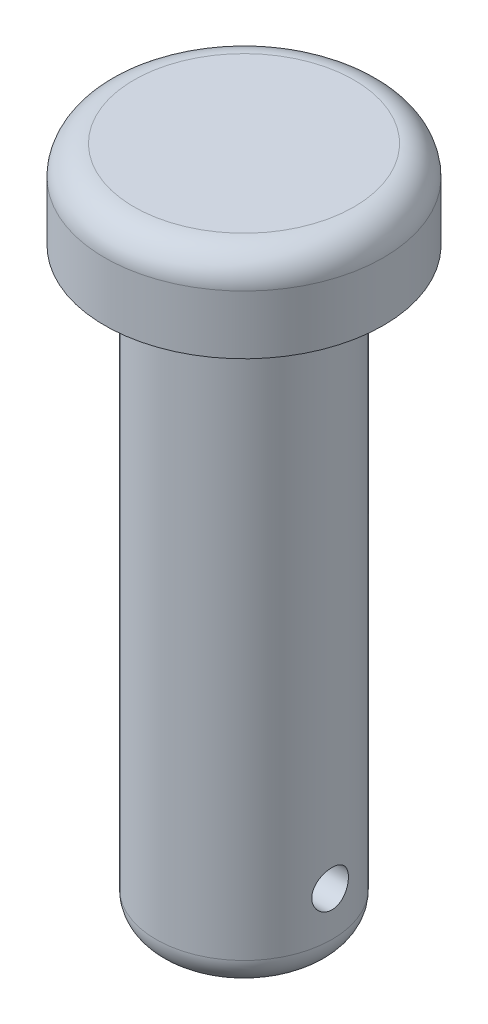
ISO-10303-21;
HEADER;
FILE_DESCRIPTION(('STEP AP214'),'2;1');
FILE_NAME('part.step','',(''),(''),'','','');
FILE_SCHEMA(('AUTOMOTIVE_DESIGN { 1 0 10303 214 1 1 1 1 }'));
ENDSEC;
DATA;
#1=APPLICATION_CONTEXT('core data for automotive mechanical design processes');
#2=APPLICATION_PROTOCOL_DEFINITION('international standard','automotive_design',2000,#1);
#3=PRODUCT_CONTEXT('',#1,'mechanical');
#4=PRODUCT('Part','Part','',(#3));
#5=PRODUCT_RELATED_PRODUCT_CATEGORY('part','',(#4));
#6=PRODUCT_DEFINITION_FORMATION('','',#4);
#7=PRODUCT_DEFINITION_CONTEXT('part definition',#1,'design');
#8=PRODUCT_DEFINITION('design','',#6,#7);
#9=PRODUCT_DEFINITION_SHAPE('','',#8);
#10=(LENGTH_UNIT() NAMED_UNIT(*) SI_UNIT(.MILLI.,.METRE.));
#11=(NAMED_UNIT(*) PLANE_ANGLE_UNIT() SI_UNIT($,.RADIAN.));
#12=(NAMED_UNIT(*) SI_UNIT($,.STERADIAN.) SOLID_ANGLE_UNIT());
#13=UNCERTAINTY_MEASURE_WITH_UNIT(LENGTH_MEASURE(1.E-05),#10,'distance_accuracy_value','');
#14=(GEOMETRIC_REPRESENTATION_CONTEXT(3) GLOBAL_UNCERTAINTY_ASSIGNED_CONTEXT((#13)) GLOBAL_UNIT_ASSIGNED_CONTEXT((#10,
#11,#12)) REPRESENTATION_CONTEXT('',''));
#15=CARTESIAN_POINT('',(0.,0.,0.));
#16=DIRECTION('',(0.,0.,1.));
#17=DIRECTION('',(1.,0.,0.));
#18=AXIS2_PLACEMENT_3D('',#15,#16,#17);
#19=CARTESIAN_POINT('',(0.,0.,0.));
#20=DIRECTION('',(0.,-1.,0.));
#21=DIRECTION('',(1.,0.,0.));
#22=AXIS2_PLACEMENT_3D('',#19,#20,#21);
#23=PLANE('',#22);
#24=CARTESIAN_POINT('',(0.,0.,0.));
#25=DIRECTION('',(0.,-1.,0.));
#26=DIRECTION('',(1.,0.,0.));
#27=AXIS2_PLACEMENT_3D('',#24,#25,#26);
#28=CIRCLE('',#27,7.99999999999997);
#29=CARTESIAN_POINT('',(7.99999999999997,0.,0.));
#30=VERTEX_POINT('',#29);
#31=EDGE_CURVE('E12',#30,#30,#28,.T.);
#32=ORIENTED_EDGE('',*,*,#31,.T.);
#33=EDGE_LOOP('',(#32));
#34=FACE_BOUND('',#33,.T.);
#35=ADVANCED_FACE('F50',(#34),#23,.T.);
#36=CARTESIAN_POINT('',(0.,4.,0.));
#37=DIRECTION('',(0.,-1.,0.));
#38=DIRECTION('',(1.,0.,0.));
#39=AXIS2_PLACEMENT_3D('',#36,#37,#38);
#40=TOROIDAL_SURFACE('',#39,8.00000000000001,4.);
#41=CARTESIAN_POINT('',(0.,4.00000000000001,0.));
#42=DIRECTION('',(0.,-1.,0.));
#43=DIRECTION('',(1.,0.,0.));
#44=AXIS2_PLACEMENT_3D('',#41,#42,#43);
#45=CIRCLE('',#44,12.);
#46=CARTESIAN_POINT('',(12.,4.00000000000006,0.));
#47=VERTEX_POINT('',#46);
#48=EDGE_CURVE('E63',#47,#47,#45,.T.);
#49=ORIENTED_EDGE('',*,*,#48,.T.);
#50=EDGE_LOOP('',(#49));
#51=FACE_BOUND('',#50,.T.);
#52=ORIENTED_EDGE('',*,*,#31,.F.);
#53=EDGE_LOOP('',(#52));
#54=FACE_BOUND('',#53,.T.);
#55=ADVANCED_FACE('F105',(#51,#54),#40,.T.);
#56=CARTESIAN_POINT('',(2.85188539450587E-12,-790.652262501241,-1.17961196366423E-13));
#57=DIRECTION('',(0.,-1.,0.));
#58=DIRECTION('',(1.,0.,0.));
#59=AXIS2_PLACEMENT_3D('',#56,#57,#58);
#60=CYLINDRICAL_SURFACE('',#59,12.0000000000001);
#61=CARTESIAN_POINT('',(12.0000000000001,12.5,0.));
#62=CARTESIAN_POINT('',(11.9999974305331,12.4999950450616,0.138818083403371));
#63=CARTESIAN_POINT('',(11.9975665755012,12.4883986685625,0.277697579041803));
#64=CARTESIAN_POINT('',(11.9881040198139,12.4423613009343,0.551522632534029));
#65=CARTESIAN_POINT('',(11.981068823785,12.4079029539262,0.686465120256656));
#66=CARTESIAN_POINT('',(11.9631821839241,12.3172590901564,0.948418264582725));
#67=CARTESIAN_POINT('',(11.9523345410532,12.2610952080022,1.07543667341843));
#68=CARTESIAN_POINT('',(11.9279985561975,12.1287007822877,1.31824065721199));
#69=CARTESIAN_POINT('',(11.9145103325195,12.0524711376884,1.43402673506871));
#70=CARTESIAN_POINT('',(11.8861540004931,11.8809273196187,1.65278064861773));
#71=CARTESIAN_POINT('',(11.8712701169709,11.7853759975298,1.75556048832544));
#72=CARTESIAN_POINT('',(11.8419131538493,11.5784106816098,1.94375555353883));
#73=CARTESIAN_POINT('',(11.8274401083337,11.4669953762555,2.02916934192198));
#74=CARTESIAN_POINT('',(11.8003888519062,11.2300960624677,2.18102063354434));
#75=CARTESIAN_POINT('',(11.7878309034969,11.1044832309945,2.24726109361307));
#76=CARTESIAN_POINT('',(11.7662568130007,10.8436050964545,2.35762238696133));
#77=CARTESIAN_POINT('',(11.7572402893515,10.7083408351149,2.40174560335284));
#78=CARTESIAN_POINT('',(11.7439300197225,10.4340295251687,2.46600480267475));
#79=CARTESIAN_POINT('',(11.7395711371177,10.2950632813305,2.48647195393602));
#80=CARTESIAN_POINT('',(11.7358738143302,10.0156063142747,2.50386715311234));
#81=CARTESIAN_POINT('',(11.7365348160197,9.87511576226941,2.50079781789376));
#82=CARTESIAN_POINT('',(11.7427434863836,9.59903794404967,2.47147438074397));
#83=CARTESIAN_POINT('',(11.7482106735984,9.46340804067761,2.44560210465445));
#84=CARTESIAN_POINT('',(11.7632887523192,9.19845698071018,2.37201087059896));
#85=CARTESIAN_POINT('',(11.7728998568264,9.06913614878736,2.32429078962768));
#86=CARTESIAN_POINT('',(11.7952638292821,8.81938554316806,2.20800006427861));
#87=CARTESIAN_POINT('',(11.8080390757121,8.6990274069459,2.13928005068479));
#88=CARTESIAN_POINT('',(11.8352778002148,8.47140851146371,1.9830453985497));
#89=CARTESIAN_POINT('',(11.8497414879708,8.36414938232805,1.89552842452524));
#90=CARTESIAN_POINT('',(11.8790746185983,8.16357207783926,1.70214984309364));
#91=CARTESIAN_POINT('',(11.8939464639898,8.07056766220601,1.59596286682424));
#92=CARTESIAN_POINT('',(11.9221617628604,7.90363911554209,1.36933457722367));
#93=CARTESIAN_POINT('',(11.9355051934048,7.82971527080322,1.24889305005159));
#94=CARTESIAN_POINT('',(11.9591974188564,7.7029798369281,0.996811082471019));
#95=CARTESIAN_POINT('',(11.9695407942055,7.65020639086579,0.86515092385307));
#96=CARTESIAN_POINT('',(11.9860267642259,7.56761659032904,0.59456924194438));
#97=CARTESIAN_POINT('',(11.9921699119212,7.53779721353721,0.455648677190239));
#98=CARTESIAN_POINT('',(11.9994855043092,7.50241149586424,0.177183731401719));
#99=CARTESIAN_POINT('',(12.0007458707519,7.49641611701152,0.0376961110524026));
#100=CARTESIAN_POINT('',(11.9983990450558,7.50768989993822,-0.240287597515389));
#101=CARTESIAN_POINT('',(11.9947921509632,7.52495763720319,-0.378783745924479));
#102=CARTESIAN_POINT('',(11.9831712995838,7.58191130693907,-0.649452734239598));
#103=CARTESIAN_POINT('',(11.9752010573619,7.62137497076696,-0.781674385788389));
#104=CARTESIAN_POINT('',(11.9557445448482,7.72135572084284,-1.03762289332264));
#105=CARTESIAN_POINT('',(11.9442579948917,7.78187448173197,-1.16134907267352));
#106=CARTESIAN_POINT('',(11.9188248298144,7.92316075647513,-1.39858861388696));
#107=CARTESIAN_POINT('',(11.9048478762469,8.00418385913816,-1.51194643893964));
#108=CARTESIAN_POINT('',(11.8760513659945,8.18383912615258,-1.72361089177302));
#109=CARTESIAN_POINT('',(11.8612317108503,8.28247335103789,-1.82191575582654));
#110=CARTESIAN_POINT('',(11.8321204906276,8.49651115399941,-2.00235729730357));
#111=CARTESIAN_POINT('',(11.8178417861503,8.61216606391059,-2.08419829200405));
#112=CARTESIAN_POINT('',(11.7917120203164,8.85583256842761,-2.22729438158484));
#113=CARTESIAN_POINT('',(11.7798608578931,8.98384364827822,-2.28855033355726));
#114=CARTESIAN_POINT('',(11.7600340141609,9.24792239259647,-2.38834492887842));
#115=CARTESIAN_POINT('',(11.752037455694,9.38394207433169,-2.42700619656059));
#116=CARTESIAN_POINT('',(11.7407836941942,9.66073310098455,-2.4808807704681));
#117=CARTESIAN_POINT('',(11.7375258132075,9.8015037632389,-2.49609743088879));
#118=CARTESIAN_POINT('',(11.7361581461703,10.0808268019993,-2.5025185297522));
#119=CARTESIAN_POINT('',(11.7379480464303,10.2193681404441,-2.49419085245447));
#120=CARTESIAN_POINT('',(11.7462489450988,10.4930280178404,-2.45479810628059));
#121=CARTESIAN_POINT('',(11.7527598981926,10.6281465896322,-2.42373325564528));
#122=CARTESIAN_POINT('',(11.7697226489544,10.8907955437813,-2.33996435537166));
#123=CARTESIAN_POINT('',(11.7801631401589,11.0183464929739,-2.28732235136839));
#124=CARTESIAN_POINT('',(11.803814114775,11.2628775520533,-2.16194914599511));
#125=CARTESIAN_POINT('',(11.8170248553093,11.3798566792663,-2.08921607966055));
#126=CARTESIAN_POINT('',(11.845031591023,11.6022432541589,-1.92414739068478));
#127=CARTESIAN_POINT('',(11.8598522773684,11.70739824913,-1.83147578083642));
#128=CARTESIAN_POINT('',(11.8892367916645,11.9008189864527,-1.62984887623065));
#129=CARTESIAN_POINT('',(11.9038005596977,11.989080835103,-1.52088983766591));
#130=CARTESIAN_POINT('',(11.9312288909528,12.1471771463681,-1.28826885501538));
#131=CARTESIAN_POINT('',(11.9440719214652,12.2167873597726,-1.16445184304268));
#132=CARTESIAN_POINT('',(11.9663981698821,12.3341004568601,-0.906639687996895));
#133=CARTESIAN_POINT('',(11.975884323642,12.3818224943638,-0.772653563814463));
#134=CARTESIAN_POINT('',(11.988649995629,12.4450805565769,-0.532030585800179));
#135=CARTESIAN_POINT('',(11.9928807132282,12.4656375264177,-0.426735187455828));
#136=CARTESIAN_POINT('',(11.9985566557955,12.4930989085547,-0.214305348353039));
#137=CARTESIAN_POINT('',(12.0000019836918,12.5000038253344,-0.107170975697702));
#138=CARTESIAN_POINT('',(12.0000000000001,12.5,0.));
#139=B_SPLINE_CURVE_WITH_KNOTS('',3,(#61,#62,#63,#64,#65,#66,#67,#68,#69,#70,#71,#72,#73,#74,
#75,#76,#77,#78,#79,#80,#81,#82,#83,#84,#85,#86,#87,#88,#89,#90,#91,#92,#93,#94,#95,#96,#97,#98,
#99,#100,#101,#102,#103,#104,#105,#106,#107,#108,#109,#110,#111,#112,#113,#114,#115,#116,#117,
#118,#119,#120,#121,#122,#123,#124,#125,#126,#127,#128,#129,#130,#131,#132,#133,#134,#135,#136,
#137,#138),.UNSPECIFIED.,.T.,.F.,(4,2,2,2,2,2,2,2,2,2,2,2,2,2,2,2,2,2,2,2,2,2,2,2,2,2,2,2,2,2,2,
2,2,2,2,2,2,2,4),(0.,0.416062090206361,0.832440399812444,1.2484047576509,1.664350483146,
2.08575052776245,2.5071854310357,2.93280898357097,3.35838666570982,3.77793150339709,
4.19742969534328,4.61003424258117,5.02266000060556,5.43829184833495,5.85397536736065,
6.27779052710928,6.70161204556432,7.12619448999322,7.5507210209154,7.9675667881535,
8.38438703104556,8.79710573265244,9.20985726781867,9.62803167991475,10.0462550512915,
10.4714252765867,10.8965777970262,11.3194010019005,11.7421637082837,12.1565844658208,
12.5710012456272,12.9842346278651,13.3975063816296,13.8183804966062,14.2393515023474,
14.6651772879651,15.0906297292995,15.4118517695456,15.7330619394678),.UNSPECIFIED.);
#140=CARTESIAN_POINT('',(12.0000000000001,12.5,0.));
#141=VERTEX_POINT('',#140);
#142=EDGE_CURVE('E53',#141,#141,#139,.T.);
#143=ORIENTED_EDGE('',*,*,#142,.F.);
#144=EDGE_LOOP('',(#143));
#145=FACE_BOUND('',#144,.T.);
#146=CARTESIAN_POINT('',(-11.7366945943057,10.,-2.49999999999994));
#147=CARTESIAN_POINT('',(-11.7366973843004,9.86121876969623,-2.49999501755294));
#148=CARTESIAN_POINT('',(-11.7391829184982,9.7223760559691,-2.48840458867917));
#149=CARTESIAN_POINT('',(-11.7488403116286,9.44862736536596,-2.44239298467526));
#150=CARTESIAN_POINT('',(-11.756015762766,9.31372448898728,-2.40795430880672));
#151=CARTESIAN_POINT('',(-11.7742058592408,9.05185525433015,-2.31736795014462));
#152=CARTESIAN_POINT('',(-11.7852165141394,8.92488080801636,-2.2612428249786));
#153=CARTESIAN_POINT('',(-11.8098316267142,8.68215100070883,-2.12893977203458));
#154=CARTESIAN_POINT('',(-11.8234359795525,8.56639518653999,-2.05276265471636));
#155=CARTESIAN_POINT('',(-11.8519386932297,8.34760924969307,-1.88127279893214));
#156=CARTESIAN_POINT('',(-11.8668522874608,8.24477621274706,-1.78571110973928));
#157=CARTESIAN_POINT('',(-11.8961593360514,8.05647786270379,-1.57870244776119));
#158=CARTESIAN_POINT('',(-11.9105527521985,7.97101382341712,-1.46725431091193));
#159=CARTESIAN_POINT('',(-11.9373627023772,7.81910822383429,-1.23032410599911));
#160=CARTESIAN_POINT('',(-11.9497591726248,7.75285494707348,-1.10471885640981));
#161=CARTESIAN_POINT('',(-11.971006946866,7.64246789428046,-0.843857102013392));
#162=CARTESIAN_POINT('',(-11.9798586112246,7.59833186969298,-0.708601579901158));
#163=CARTESIAN_POINT('',(-11.9929117978437,7.53404847776509,-0.434325808400997));
#164=CARTESIAN_POINT('',(-11.9971778391985,7.51356796560969,-0.2953867618327));
#165=CARTESIAN_POINT('',(-12.0008022516122,7.49613660848598,-0.0159836976790241));
#166=CARTESIAN_POINT('',(-12.000161134074,7.49918331161383,0.124480159473705));
#167=CARTESIAN_POINT('',(-11.9940931618104,7.52846920191351,0.400653172399168));
#168=CARTESIAN_POINT('',(-11.9887403791317,7.55434943791624,0.536402257452969));
#169=CARTESIAN_POINT('',(-11.9739344179777,7.62799725066262,0.801587492579518));
#170=CARTESIAN_POINT('',(-11.9644810658382,7.67576575440619,0.931023375022058));
#171=CARTESIAN_POINT('',(-11.9424153464786,7.79216010425102,1.18092001076938));
#172=CARTESIAN_POINT('',(-11.9297820825069,7.86092458841931,1.30131426996331));
#173=CARTESIAN_POINT('',(-11.9027460088038,8.01725600568082,1.52898691302131));
#174=CARTESIAN_POINT('',(-11.8883429791667,8.10482527641228,1.63626366363284));
#175=CARTESIAN_POINT('',(-11.8590340046657,8.29824324978213,1.83678840655383));
#176=CARTESIAN_POINT('',(-11.8441236995185,8.40440611996388,1.92973297498961));
#177=CARTESIAN_POINT('',(-11.8157374529799,8.63096409798958,2.09655194480978));
#178=CARTESIAN_POINT('',(-11.8022615435434,8.75135952277448,2.17042592139961));
#179=CARTESIAN_POINT('',(-11.7782599681833,9.00342450965762,2.2971243427691));
#180=CARTESIAN_POINT('',(-11.7677417046425,9.13512130138687,2.34989610979458));
#181=CARTESIAN_POINT('',(-11.7509521282072,9.40578323873877,2.4324715507735));
#182=CARTESIAN_POINT('',(-11.7446802101438,9.5447473456162,2.46227849764702));
#183=CARTESIAN_POINT('',(-11.7372156647828,9.82323941263783,2.49761727734039));
#184=CARTESIAN_POINT('',(-11.7359310372695,9.96270916907408,2.50358885836001));
#185=CARTESIAN_POINT('',(-11.7383390403741,10.2406516230803,2.49227386878594));
#186=CARTESIAN_POINT('',(-11.7420313630527,10.3791243818047,2.47498873715731));
#187=CARTESIAN_POINT('',(-11.7538907645235,10.6496410321163,2.41803116650973));
#188=CARTESIAN_POINT('',(-11.76201022566,10.7817373343577,2.37859682753748));
#189=CARTESIAN_POINT('',(-11.7817667700624,11.0374479788832,2.27871621721842));
#190=CARTESIAN_POINT('',(-11.7934041638213,11.1610615713008,2.21826809112295));
#191=CARTESIAN_POINT('',(-11.819090038744,11.3982128824325,2.07709196362971));
#192=CARTESIAN_POINT('',(-11.8331701329665,11.5115844089324,1.99609065470795));
#193=CARTESIAN_POINT('',(-11.8620696798781,11.7232864983102,1.81646888113978));
#194=CARTESIAN_POINT('',(-11.8768892153308,11.8216153724785,1.71784644101036));
#195=CARTESIAN_POINT('',(-11.9058984863349,12.0021254261943,1.50380090168668));
#196=CARTESIAN_POINT('',(-11.9200734943982,12.0840081900528,1.38812381522911));
#197=CARTESIAN_POINT('',(-11.9459341754481,12.227177504176,1.14440020443274));
#198=CARTESIAN_POINT('',(-11.9576199584165,12.2884649644749,1.01635422695378));
#199=CARTESIAN_POINT('',(-11.9771229654137,12.3882773586347,0.752284235695867));
#200=CARTESIAN_POINT('',(-11.9849632627299,12.4269383310887,0.616313421940422));
#201=CARTESIAN_POINT('',(-11.9959912282046,12.4808288080162,0.339626801006987));
#202=CARTESIAN_POINT('',(-11.9991795068581,12.4960613870655,0.198911618923439));
#203=CARTESIAN_POINT('',(-12.0005281611389,12.502535244097,-0.0804266869406074));
#204=CARTESIAN_POINT('',(-11.9987822750957,12.4942237999895,-0.219039184355756));
#205=CARTESIAN_POINT('',(-11.99065748189,12.4548387226941,-0.492845740747073));
#206=CARTESIAN_POINT('',(-11.984278643459,12.4237654271863,-0.628039850405446));
#207=CARTESIAN_POINT('',(-11.9676092015491,12.339944410703,-0.890863930983977));
#208=CARTESIAN_POINT('',(-11.9573290681437,12.2872546722944,-1.01851310000868));
#209=CARTESIAN_POINT('',(-11.9339599069615,12.1617552045355,-1.26322113444175));
#210=CARTESIAN_POINT('',(-11.9208706346329,12.0889437233117,-1.38027907656017));
#211=CARTESIAN_POINT('',(-11.8930319356997,11.9237806640155,-1.60268064259531));
#212=CARTESIAN_POINT('',(-11.8782576059507,11.8311114238945,-1.70778526722734));
#213=CARTESIAN_POINT('',(-11.8488557363333,11.6295109979979,-1.9011054839652));
#214=CARTESIAN_POINT('',(-11.8342282323046,11.5205759400736,-1.98931704315915));
#215=CARTESIAN_POINT('',(-11.8065838324645,11.287981795159,-2.14734903704121));
#216=CARTESIAN_POINT('',(-11.7935881325423,11.1641631771794,-2.21693856248131));
#217=CARTESIAN_POINT('',(-11.7709407916825,10.9063496879379,-2.33421255844765));
#218=CARTESIAN_POINT('',(-11.7612862067079,10.7723639031215,-2.381916325835));
#219=CARTESIAN_POINT('',(-11.7482800883642,10.5317874368468,-2.44513108264677));
#220=CARTESIAN_POINT('',(-11.743963271902,10.4265409268095,-2.46566898011596));
#221=CARTESIAN_POINT('',(-11.7381695052652,10.2142084389624,-2.49310508716544));
#222=CARTESIAN_POINT('',(-11.736692440763,10.1071225353813,-2.50000384585398));
#223=CARTESIAN_POINT('',(-11.7366945943057,10.,-2.49999999999994));
#224=B_SPLINE_CURVE_WITH_KNOTS('',3,(#146,#147,#148,#149,#150,#151,#152,#153,#154,#155,#156,
#157,#158,#159,#160,#161,#162,#163,#164,#165,#166,#167,#168,#169,#170,#171,#172,#173,#174,#175,
#176,#177,#178,#179,#180,#181,#182,#183,#184,#185,#186,#187,#188,#189,#190,#191,#192,#193,#194,
#195,#196,#197,#198,#199,#200,#201,#202,#203,#204,#205,#206,#207,#208,#209,#210,#211,#212,#213,
#214,#215,#216,#217,#218,#219,#220,#221,#222,#223),.UNSPECIFIED.,.T.,.F.,(4,2,2,2,2,2,2,2,2,2,2,
2,2,2,2,2,2,2,2,2,2,2,2,2,2,2,2,2,2,2,2,2,2,2,2,2,2,2,4),(0.,0.41595130814255,0.832221584834957,
1.24806002960546,1.66388166963158,2.08542666935772,2.50700257327752,2.93258052533688,
3.35811520213862,3.77758097718525,4.19700303792675,4.60994682832919,5.02290810911737,
5.43865743955894,5.85445848208515,6.27811724489822,6.70178544383251,7.12650474664972,
7.55116350775191,7.96795032019582,8.38471134593045,8.79707572463844,9.20947650928061,
9.62767835869302,10.0459271216437,10.4711891750669,10.8964324351808,11.3190919929707,
11.7416960791916,12.1563258784529,12.5709495266596,12.984468211702,13.3980229105635,
13.8187663795715,14.2396101685507,14.6654530271771,15.0909196914727,15.4119973517483,
15.7330620852561),.UNSPECIFIED.);
#225=CARTESIAN_POINT('',(-11.7366945943057,10.,-2.49999999999994));
#226=VERTEX_POINT('',#225);
#227=EDGE_CURVE('E73',#226,#226,#224,.T.);
#228=ORIENTED_EDGE('',*,*,#227,.F.);
#229=EDGE_LOOP('',(#228));
#230=FACE_BOUND('',#229,.T.);
#231=CARTESIAN_POINT('',(-2.84494650060196E-13,80.0000000000001,0.));
#232=DIRECTION('',(0.,-1.,0.));
#233=DIRECTION('',(1.,0.,0.));
#234=AXIS2_PLACEMENT_3D('',#231,#232,#233);
#235=CIRCLE('',#234,12.0000000000003);
#236=CARTESIAN_POINT('',(12.,80.0000000000001,0.));
#237=VERTEX_POINT('',#236);
#238=EDGE_CURVE('E70',#237,#237,#235,.T.);
#239=ORIENTED_EDGE('',*,*,#238,.T.);
#240=EDGE_LOOP('',(#239));
#241=FACE_BOUND('',#240,.T.);
#242=ORIENTED_EDGE('',*,*,#48,.F.);
#243=EDGE_LOOP('',(#242));
#244=FACE_BOUND('',#243,.T.);
#245=ADVANCED_FACE('F79',(#145,#230,#241,#244),#60,.T.);
#246=CARTESIAN_POINT('',(12.,80.0000000000001,0.));
#247=DIRECTION('',(0.,-1.,0.));
#248=DIRECTION('',(1.,0.,0.));
#249=AXIS2_PLACEMENT_3D('',#246,#247,#248);
#250=PLANE('',#249);
#251=CARTESIAN_POINT('',(-2.70616862252382E-13,80.,0.));
#252=DIRECTION('',(0.,-1.,0.));
#253=DIRECTION('',(1.,0.,0.));
#254=AXIS2_PLACEMENT_3D('',#251,#252,#253);
#255=CIRCLE('',#254,19.0000000000003);
#256=CARTESIAN_POINT('',(19.,80.0000000000001,0.));
#257=VERTEX_POINT('',#256);
#258=EDGE_CURVE('E162',#257,#257,#255,.T.);
#259=ORIENTED_EDGE('',*,*,#258,.T.);
#260=EDGE_LOOP('',(#259));
#261=FACE_BOUND('',#260,.T.);
#262=ORIENTED_EDGE('',*,*,#238,.F.);
#263=EDGE_LOOP('',(#262));
#264=FACE_BOUND('',#263,.T.);
#265=ADVANCED_FACE('F98',(#261,#264),#250,.T.);
#266=CARTESIAN_POINT('',(2.85188539450587E-12,-790.652262501241,-1.17961196366423E-13));
#267=DIRECTION('',(0.,-1.,0.));
#268=DIRECTION('',(1.,0.,0.));
#269=AXIS2_PLACEMENT_3D('',#266,#267,#268);
#270=CYLINDRICAL_SURFACE('',#269,19.0000000000003);
#271=CARTESIAN_POINT('',(-2.84494650060196E-13,88.,0.));
#272=DIRECTION('',(0.,-1.,0.));
#273=DIRECTION('',(1.,0.,0.));
#274=AXIS2_PLACEMENT_3D('',#271,#272,#273);
#275=CIRCLE('',#274,19.0000000000003);
#276=CARTESIAN_POINT('',(19.,88.0000000000001,0.));
#277=VERTEX_POINT('',#276);
#278=EDGE_CURVE('E169',#277,#277,#275,.T.);
#279=ORIENTED_EDGE('',*,*,#278,.T.);
#280=EDGE_LOOP('',(#279));
#281=FACE_BOUND('',#280,.T.);
#282=ORIENTED_EDGE('',*,*,#258,.F.);
#283=EDGE_LOOP('',(#282));
#284=FACE_BOUND('',#283,.T.);
#285=ADVANCED_FACE('F95',(#281,#284),#270,.T.);
#286=CARTESIAN_POINT('',(-2.84494650060196E-13,88.0000000000001,0.));
#287=DIRECTION('',(0.,-1.,0.));
#288=DIRECTION('',(1.,0.,0.));
#289=AXIS2_PLACEMENT_3D('',#286,#287,#288);
#290=TOROIDAL_SURFACE('',#289,15.0000000000003,4.);
#291=CARTESIAN_POINT('',(-3.81639164714898E-13,92.,0.));
#292=DIRECTION('',(0.,-1.,0.));
#293=DIRECTION('',(1.,0.,0.));
#294=AXIS2_PLACEMENT_3D('',#291,#292,#293);
#295=CIRCLE('',#294,15.0000000000003);
#296=CARTESIAN_POINT('',(14.9999999999999,92.0000000000001,0.));
#297=VERTEX_POINT('',#296);
#298=EDGE_CURVE('E175',#297,#297,#295,.T.);
#299=ORIENTED_EDGE('',*,*,#298,.T.);
#300=EDGE_LOOP('',(#299));
#301=FACE_BOUND('',#300,.T.);
#302=ORIENTED_EDGE('',*,*,#278,.F.);
#303=EDGE_LOOP('',(#302));
#304=FACE_BOUND('',#303,.T.);
#305=ADVANCED_FACE('F91',(#301,#304),#290,.T.);
#306=CARTESIAN_POINT('',(15.,92.0000000000001,0.));
#307=DIRECTION('',(0.,1.,0.));
#308=DIRECTION('',(-1.,0.,0.));
#309=AXIS2_PLACEMENT_3D('',#306,#307,#308);
#310=PLANE('',#309);
#311=ORIENTED_EDGE('',*,*,#298,.F.);
#312=EDGE_LOOP('',(#311));
#313=FACE_BOUND('',#312,.T.);
#314=ADVANCED_FACE('F86',(#313),#310,.T.);
#315=CARTESIAN_POINT('',(-19.0000000000006,10.,0.));
#316=DIRECTION('',(1.,0.,0.));
#317=DIRECTION('',(0.,0.,-0.999999999999999));
#318=AXIS2_PLACEMENT_3D('',#315,#316,#317);
#319=CYLINDRICAL_SURFACE('',#318,2.5);
#320=ORIENTED_EDGE('',*,*,#142,.T.);
#321=EDGE_LOOP('',(#320));
#322=FACE_BOUND('',#321,.T.);
#323=ORIENTED_EDGE('',*,*,#227,.T.);
#324=EDGE_LOOP('',(#323));
#325=FACE_BOUND('',#324,.T.);
#326=ADVANCED_FACE('F82',(#322,#325),#319,.F.);
#327=CLOSED_SHELL('',(#35,#55,#245,#265,#285,#305,#314,#326));
#328=MANIFOLD_SOLID_BREP('B2',#327);
#329=ADVANCED_BREP_SHAPE_REPRESENTATION('',(#18,#328),#14);
#330=SHAPE_DEFINITION_REPRESENTATION(#9,#329);
ENDSEC;
END-ISO-10303-21;
